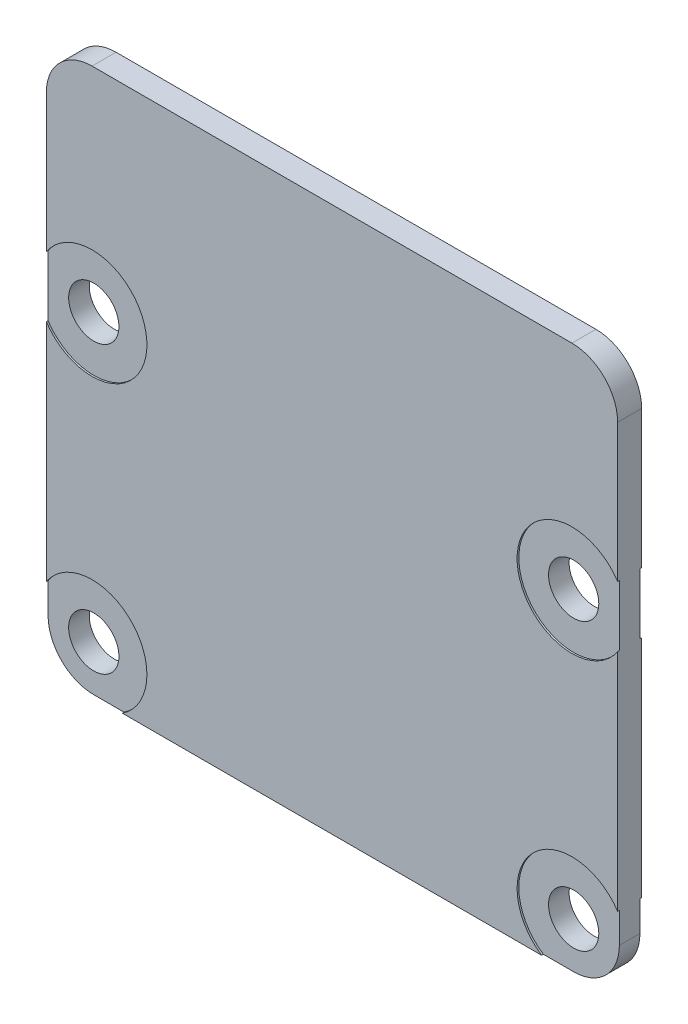
ISO-10303-21;
HEADER;
FILE_DESCRIPTION(('STEP AP214'),'2;1');
FILE_NAME('part.step','',(''),(''),'','','');
FILE_SCHEMA(('AUTOMOTIVE_DESIGN { 1 0 10303 214 1 1 1 1 }'));
ENDSEC;
DATA;
#1=APPLICATION_CONTEXT('core data for automotive mechanical design processes');
#2=APPLICATION_PROTOCOL_DEFINITION('international standard','automotive_design',2000,#1);
#3=PRODUCT_CONTEXT('',#1,'mechanical');
#4=PRODUCT('Part','Part','',(#3));
#5=PRODUCT_RELATED_PRODUCT_CATEGORY('part','',(#4));
#6=PRODUCT_DEFINITION_FORMATION('','',#4);
#7=PRODUCT_DEFINITION_CONTEXT('part definition',#1,'design');
#8=PRODUCT_DEFINITION('design','',#6,#7);
#9=PRODUCT_DEFINITION_SHAPE('','',#8);
#10=(LENGTH_UNIT() NAMED_UNIT(*) SI_UNIT(.MILLI.,.METRE.));
#11=(NAMED_UNIT(*) PLANE_ANGLE_UNIT() SI_UNIT($,.RADIAN.));
#12=(NAMED_UNIT(*) SI_UNIT($,.STERADIAN.) SOLID_ANGLE_UNIT());
#13=UNCERTAINTY_MEASURE_WITH_UNIT(LENGTH_MEASURE(1.E-05),#10,'distance_accuracy_value','');
#14=(GEOMETRIC_REPRESENTATION_CONTEXT(3) GLOBAL_UNCERTAINTY_ASSIGNED_CONTEXT((#13)) GLOBAL_UNIT_ASSIGNED_CONTEXT((#10,
#11,#12)) REPRESENTATION_CONTEXT('',''));
#15=CARTESIAN_POINT('',(0.,0.,0.));
#16=DIRECTION('',(0.,0.,1.));
#17=DIRECTION('',(1.,0.,0.));
#18=AXIS2_PLACEMENT_3D('',#15,#16,#17);
#19=CARTESIAN_POINT('',(0.,0.,-0.9));
#20=DIRECTION('',(0.,0.,1.));
#21=DIRECTION('',(1.,0.,0.));
#22=AXIS2_PLACEMENT_3D('',#19,#20,#21);
#23=PLANE('',#22);
#24=CARTESIAN_POINT('',(-10.5,0.100000000000003,-0.9));
#25=DIRECTION('',(0.,0.,1.));
#26=DIRECTION('',(1.,0.,0.));
#27=AXIS2_PLACEMENT_3D('',#24,#25,#26);
#28=CIRCLE('',#27,1.1);
#29=CARTESIAN_POINT('',(-9.4,0.100000000000003,-0.9));
#30=VERTEX_POINT('',#29);
#31=EDGE_CURVE('E346',#30,#30,#28,.T.);
#32=ORIENTED_EDGE('',*,*,#31,.T.);
#33=EDGE_LOOP('',(#32));
#34=FACE_BOUND('',#33,.T.);
#35=CARTESIAN_POINT('',(-10.5,0.100000000000003,-0.9));
#36=DIRECTION('',(0.,0.,1.));
#37=DIRECTION('',(-1.,0.,0.));
#38=AXIS2_PLACEMENT_3D('',#35,#36,#37);
#39=CIRCLE('',#38,2.4);
#40=CARTESIAN_POINT('',(-12.5,-1.22664991614215,-0.9));
#41=VERTEX_POINT('',#40);
#42=CARTESIAN_POINT('',(-12.5,1.42664991614216,-0.9));
#43=VERTEX_POINT('',#42);
#44=EDGE_CURVE('E214',#41,#43,#39,.T.);
#45=ORIENTED_EDGE('',*,*,#44,.F.);
#46=DIRECTION('',(0.,-1.,0.));
#47=VECTOR('',#46,1.);
#48=CARTESIAN_POINT('',(-12.5,9.462,-0.9));
#49=LINE('',#48,#47);
#50=EDGE_CURVE('E354',#43,#41,#49,.T.);
#51=ORIENTED_EDGE('',*,*,#50,.F.);
#52=EDGE_LOOP('',(#45,#51));
#53=FACE_BOUND('',#52,.T.);
#54=ADVANCED_FACE('F32',(#34,#53),#23,.F.);
#55=CARTESIAN_POINT('',(-10.5,-12.4,-0.9));
#56=DIRECTION('',(0.,0.,1.));
#57=DIRECTION('',(1.,0.,0.));
#58=AXIS2_PLACEMENT_3D('',#55,#56,#57);
#59=CIRCLE('',#58,1.1);
#60=CARTESIAN_POINT('',(-9.4,-12.4,-0.9));
#61=VERTEX_POINT('',#60);
#62=EDGE_CURVE('E328',#61,#61,#59,.T.);
#63=ORIENTED_EDGE('',*,*,#62,.T.);
#64=EDGE_LOOP('',(#63));
#65=FACE_BOUND('',#64,.T.);
#66=CARTESIAN_POINT('',(-10.5,-12.4,-0.9));
#67=DIRECTION('',(0.,0.,1.));
#68=DIRECTION('',(-1.,0.,0.));
#69=AXIS2_PLACEMENT_3D('',#66,#67,#68);
#70=CIRCLE('',#69,2.4);
#71=CARTESIAN_POINT('',(-9.17335008385784,-14.4,-0.9));
#72=VERTEX_POINT('',#71);
#73=CARTESIAN_POINT('',(-12.5,-11.0733500838578,-0.9));
#74=VERTEX_POINT('',#73);
#75=EDGE_CURVE('E217',#72,#74,#70,.T.);
#76=ORIENTED_EDGE('',*,*,#75,.F.);
#77=DIRECTION('',(1.,0.,0.));
#78=VECTOR('',#77,1.);
#79=CARTESIAN_POINT('',(-12.5,-14.4,-0.9));
#80=LINE('',#79,#78);
#81=CARTESIAN_POINT('',(-10.5,-14.4,-0.9));
#82=VERTEX_POINT('',#81);
#83=EDGE_CURVE('E356',#82,#72,#80,.T.);
#84=ORIENTED_EDGE('',*,*,#83,.F.);
#85=CARTESIAN_POINT('',(-10.5,-12.4,-0.9));
#86=DIRECTION('',(0.,0.,1.));
#87=DIRECTION('',(1.,0.,0.));
#88=AXIS2_PLACEMENT_3D('',#85,#86,#87);
#89=CIRCLE('',#88,2.);
#90=CARTESIAN_POINT('',(-12.5,-12.4,-0.9));
#91=VERTEX_POINT('',#90);
#92=EDGE_CURVE('E387',#82,#91,#89,.F.);
#93=ORIENTED_EDGE('',*,*,#92,.T.);
#94=EDGE_CURVE('E352',#74,#91,#49,.T.);
#95=ORIENTED_EDGE('',*,*,#94,.F.);
#96=EDGE_LOOP('',(#76,#84,#93,#95));
#97=FACE_BOUND('',#96,.T.);
#98=ADVANCED_FACE('F428',(#65,#97),#23,.F.);
#99=CARTESIAN_POINT('',(10.5,-12.4,-0.9));
#100=DIRECTION('',(0.,0.,1.));
#101=DIRECTION('',(1.,0.,0.));
#102=AXIS2_PLACEMENT_3D('',#99,#100,#101);
#103=CIRCLE('',#102,1.1);
#104=CARTESIAN_POINT('',(11.6,-12.4,-0.9));
#105=VERTEX_POINT('',#104);
#106=EDGE_CURVE('E335',#105,#105,#103,.T.);
#107=ORIENTED_EDGE('',*,*,#106,.T.);
#108=EDGE_LOOP('',(#107));
#109=FACE_BOUND('',#108,.T.);
#110=CARTESIAN_POINT('',(10.5,-12.4,-0.9));
#111=DIRECTION('',(0.,0.,1.));
#112=DIRECTION('',(-1.,0.,0.));
#113=AXIS2_PLACEMENT_3D('',#110,#111,#112);
#114=CIRCLE('',#113,2.4);
#115=CARTESIAN_POINT('',(12.5,-11.0733500838578,-0.9));
#116=VERTEX_POINT('',#115);
#117=CARTESIAN_POINT('',(9.17335008385784,-14.4,-0.9));
#118=VERTEX_POINT('',#117);
#119=EDGE_CURVE('E54',#116,#118,#114,.T.);
#120=ORIENTED_EDGE('',*,*,#119,.F.);
#121=DIRECTION('',(0.,1.,0.));
#122=VECTOR('',#121,1.);
#123=CARTESIAN_POINT('',(12.5,9.462,-0.9));
#124=LINE('',#123,#122);
#125=CARTESIAN_POINT('',(12.5,-12.4,-0.9));
#126=VERTEX_POINT('',#125);
#127=EDGE_CURVE('E361',#126,#116,#124,.T.);
#128=ORIENTED_EDGE('',*,*,#127,.F.);
#129=CARTESIAN_POINT('',(10.5,-12.4,-0.9));
#130=DIRECTION('',(0.,0.,1.));
#131=DIRECTION('',(1.,0.,0.));
#132=AXIS2_PLACEMENT_3D('',#129,#130,#131);
#133=CIRCLE('',#132,2.);
#134=CARTESIAN_POINT('',(10.5,-14.4,-0.9));
#135=VERTEX_POINT('',#134);
#136=EDGE_CURVE('E384',#126,#135,#133,.F.);
#137=ORIENTED_EDGE('',*,*,#136,.T.);
#138=EDGE_CURVE('E360',#118,#135,#80,.T.);
#139=ORIENTED_EDGE('',*,*,#138,.F.);
#140=EDGE_LOOP('',(#120,#128,#137,#139));
#141=FACE_BOUND('',#140,.T.);
#142=ADVANCED_FACE('F401',(#109,#141),#23,.F.);
#143=CARTESIAN_POINT('',(10.5,0.100000000000003,-0.9));
#144=DIRECTION('',(0.,0.,1.));
#145=DIRECTION('',(1.,0.,0.));
#146=AXIS2_PLACEMENT_3D('',#143,#144,#145);
#147=CIRCLE('',#146,1.1);
#148=CARTESIAN_POINT('',(11.6,0.100000000000003,-0.9));
#149=VERTEX_POINT('',#148);
#150=EDGE_CURVE('E341',#149,#149,#147,.T.);
#151=ORIENTED_EDGE('',*,*,#150,.T.);
#152=EDGE_LOOP('',(#151));
#153=FACE_BOUND('',#152,.T.);
#154=CARTESIAN_POINT('',(10.5,0.100000000000003,-0.9));
#155=DIRECTION('',(0.,0.,1.));
#156=DIRECTION('',(-1.,0.,0.));
#157=AXIS2_PLACEMENT_3D('',#154,#155,#156);
#158=CIRCLE('',#157,2.4);
#159=CARTESIAN_POINT('',(12.5,1.42664991614216,-0.9));
#160=VERTEX_POINT('',#159);
#161=CARTESIAN_POINT('',(12.5,-1.22664991614215,-0.9));
#162=VERTEX_POINT('',#161);
#163=EDGE_CURVE('E46',#160,#162,#158,.T.);
#164=ORIENTED_EDGE('',*,*,#163,.F.);
#165=EDGE_CURVE('E359',#162,#160,#124,.T.);
#166=ORIENTED_EDGE('',*,*,#165,.F.);
#167=EDGE_LOOP('',(#164,#166));
#168=FACE_BOUND('',#167,.T.);
#169=ADVANCED_FACE('F491',(#153,#168),#23,.F.);
#170=CARTESIAN_POINT('',(0.,0.,0.));
#171=DIRECTION('',(0.,0.,1.));
#172=DIRECTION('',(1.,0.,0.));
#173=AXIS2_PLACEMENT_3D('',#170,#171,#172);
#174=PLANE('',#173);
#175=CARTESIAN_POINT('',(10.5,0.100000000000003,0.));
#176=DIRECTION('',(0.,0.,1.));
#177=DIRECTION('',(1.,0.,0.));
#178=AXIS2_PLACEMENT_3D('',#175,#176,#177);
#179=CIRCLE('',#178,1.1);
#180=CARTESIAN_POINT('',(11.6,0.100000000000003,0.));
#181=VERTEX_POINT('',#180);
#182=EDGE_CURVE('E327',#181,#181,#179,.T.);
#183=ORIENTED_EDGE('',*,*,#182,.F.);
#184=EDGE_LOOP('',(#183));
#185=FACE_BOUND('',#184,.T.);
#186=CARTESIAN_POINT('',(10.5,0.100000000000003,0.));
#187=DIRECTION('',(0.,0.,-1.));
#188=DIRECTION('',(1.,0.,0.));
#189=AXIS2_PLACEMENT_3D('',#186,#187,#188);
#190=CIRCLE('',#189,2.4);
#191=CARTESIAN_POINT('',(12.5,-1.22664991614216,0.));
#192=VERTEX_POINT('',#191);
#193=CARTESIAN_POINT('',(12.5,1.42664991614216,0.));
#194=VERTEX_POINT('',#193);
#195=EDGE_CURVE('E269',#192,#194,#190,.T.);
#196=ORIENTED_EDGE('',*,*,#195,.F.);
#197=DIRECTION('',(0.,1.,0.));
#198=VECTOR('',#197,1.);
#199=CARTESIAN_POINT('',(12.5,9.462,0.));
#200=LINE('',#199,#198);
#201=EDGE_CURVE('E368',#192,#194,#200,.T.);
#202=ORIENTED_EDGE('',*,*,#201,.T.);
#203=EDGE_LOOP('',(#196,#202));
#204=FACE_BOUND('',#203,.T.);
#205=ADVANCED_FACE('F499',(#185,#204),#174,.T.);
#206=CARTESIAN_POINT('',(10.5,-12.4,0.));
#207=DIRECTION('',(0.,0.,1.));
#208=DIRECTION('',(1.,0.,0.));
#209=AXIS2_PLACEMENT_3D('',#206,#207,#208);
#210=CIRCLE('',#209,1.1);
#211=CARTESIAN_POINT('',(11.6,-12.4,0.));
#212=VERTEX_POINT('',#211);
#213=EDGE_CURVE('E338',#212,#212,#210,.T.);
#214=ORIENTED_EDGE('',*,*,#213,.F.);
#215=EDGE_LOOP('',(#214));
#216=FACE_BOUND('',#215,.T.);
#217=CARTESIAN_POINT('',(10.5,-12.4,0.));
#218=DIRECTION('',(0.,0.,-1.));
#219=DIRECTION('',(1.,0.,0.));
#220=AXIS2_PLACEMENT_3D('',#217,#218,#219);
#221=CIRCLE('',#220,2.4);
#222=CARTESIAN_POINT('',(9.17335008385784,-14.4,0.));
#223=VERTEX_POINT('',#222);
#224=CARTESIAN_POINT('',(12.5,-11.0733500838578,0.));
#225=VERTEX_POINT('',#224);
#226=EDGE_CURVE('E299',#223,#225,#221,.T.);
#227=ORIENTED_EDGE('',*,*,#226,.F.);
#228=DIRECTION('',(1.,0.,0.));
#229=VECTOR('',#228,1.);
#230=CARTESIAN_POINT('',(-12.5,-14.4,0.));
#231=LINE('',#230,#229);
#232=CARTESIAN_POINT('',(10.5,-14.4,0.));
#233=VERTEX_POINT('',#232);
#234=EDGE_CURVE('E369',#223,#233,#231,.T.);
#235=ORIENTED_EDGE('',*,*,#234,.T.);
#236=CARTESIAN_POINT('',(10.5,-12.4,0.));
#237=DIRECTION('',(0.,0.,1.));
#238=DIRECTION('',(1.,0.,0.));
#239=AXIS2_PLACEMENT_3D('',#236,#237,#238);
#240=CIRCLE('',#239,2.);
#241=CARTESIAN_POINT('',(12.5,-12.4,0.));
#242=VERTEX_POINT('',#241);
#243=EDGE_CURVE('E375',#233,#242,#240,.T.);
#244=ORIENTED_EDGE('',*,*,#243,.T.);
#245=EDGE_CURVE('E355',#242,#225,#200,.T.);
#246=ORIENTED_EDGE('',*,*,#245,.T.);
#247=EDGE_LOOP('',(#227,#235,#244,#246));
#248=FACE_BOUND('',#247,.T.);
#249=ADVANCED_FACE('F455',(#216,#248),#174,.T.);
#250=CARTESIAN_POINT('',(-10.5,-12.4,0.));
#251=DIRECTION('',(0.,0.,1.));
#252=DIRECTION('',(1.,0.,0.));
#253=AXIS2_PLACEMENT_3D('',#250,#251,#252);
#254=CIRCLE('',#253,1.1);
#255=CARTESIAN_POINT('',(-9.4,-12.4,0.));
#256=VERTEX_POINT('',#255);
#257=EDGE_CURVE('E332',#256,#256,#254,.T.);
#258=ORIENTED_EDGE('',*,*,#257,.F.);
#259=EDGE_LOOP('',(#258));
#260=FACE_BOUND('',#259,.T.);
#261=CARTESIAN_POINT('',(-10.5,-12.4,0.));
#262=DIRECTION('',(0.,0.,-1.));
#263=DIRECTION('',(1.,0.,0.));
#264=AXIS2_PLACEMENT_3D('',#261,#262,#263);
#265=CIRCLE('',#264,2.4);
#266=CARTESIAN_POINT('',(-12.5,-11.0733500838578,0.));
#267=VERTEX_POINT('',#266);
#268=CARTESIAN_POINT('',(-9.17335008385784,-14.4,0.));
#269=VERTEX_POINT('',#268);
#270=EDGE_CURVE('E296',#267,#269,#265,.T.);
#271=ORIENTED_EDGE('',*,*,#270,.F.);
#272=DIRECTION('',(0.,-1.,0.));
#273=VECTOR('',#272,1.);
#274=CARTESIAN_POINT('',(-12.5,9.462,0.));
#275=LINE('',#274,#273);
#276=CARTESIAN_POINT('',(-12.5,-12.4,0.));
#277=VERTEX_POINT('',#276);
#278=EDGE_CURVE('E349',#267,#277,#275,.T.);
#279=ORIENTED_EDGE('',*,*,#278,.T.);
#280=CARTESIAN_POINT('',(-10.5,-12.4,0.));
#281=DIRECTION('',(0.,0.,1.));
#282=DIRECTION('',(1.,0.,0.));
#283=AXIS2_PLACEMENT_3D('',#280,#281,#282);
#284=CIRCLE('',#283,2.);
#285=CARTESIAN_POINT('',(-10.5,-14.4,0.));
#286=VERTEX_POINT('',#285);
#287=EDGE_CURVE('E377',#277,#286,#284,.T.);
#288=ORIENTED_EDGE('',*,*,#287,.T.);
#289=EDGE_CURVE('E366',#286,#269,#231,.T.);
#290=ORIENTED_EDGE('',*,*,#289,.T.);
#291=EDGE_LOOP('',(#271,#279,#288,#290));
#292=FACE_BOUND('',#291,.T.);
#293=ADVANCED_FACE('F538',(#260,#292),#174,.T.);
#294=CARTESIAN_POINT('',(-10.5,0.100000000000003,0.));
#295=DIRECTION('',(0.,0.,1.));
#296=DIRECTION('',(1.,0.,0.));
#297=AXIS2_PLACEMENT_3D('',#294,#295,#296);
#298=CIRCLE('',#297,1.1);
#299=CARTESIAN_POINT('',(-9.4,0.100000000000003,0.));
#300=VERTEX_POINT('',#299);
#301=EDGE_CURVE('E331',#300,#300,#298,.T.);
#302=ORIENTED_EDGE('',*,*,#301,.F.);
#303=EDGE_LOOP('',(#302));
#304=FACE_BOUND('',#303,.T.);
#305=CARTESIAN_POINT('',(-10.5,0.100000000000003,0.));
#306=DIRECTION('',(0.,0.,-1.));
#307=DIRECTION('',(1.,0.,0.));
#308=AXIS2_PLACEMENT_3D('',#305,#306,#307);
#309=CIRCLE('',#308,2.4);
#310=CARTESIAN_POINT('',(-12.5,1.42664991614216,0.));
#311=VERTEX_POINT('',#310);
#312=CARTESIAN_POINT('',(-12.5,-1.22664991614215,0.));
#313=VERTEX_POINT('',#312);
#314=EDGE_CURVE('E266',#311,#313,#309,.T.);
#315=ORIENTED_EDGE('',*,*,#314,.F.);
#316=EDGE_CURVE('E365',#311,#313,#275,.T.);
#317=ORIENTED_EDGE('',*,*,#316,.T.);
#318=EDGE_LOOP('',(#315,#317));
#319=FACE_BOUND('',#318,.T.);
#320=ADVANCED_FACE('F453',(#304,#319),#174,.T.);
#321=CARTESIAN_POINT('',(-12.5,9.462,-0.9));
#322=DIRECTION('',(-1.,0.,0.));
#323=DIRECTION('',(0.,-1.,0.));
#324=AXIS2_PLACEMENT_3D('',#321,#322,#323);
#325=PLANE('',#324);
#326=DIRECTION('',(0.,0.,1.));
#327=VECTOR('',#326,1.);
#328=CARTESIAN_POINT('',(-12.5,7.462,-0.9));
#329=LINE('',#328,#327);
#330=CARTESIAN_POINT('',(-12.5,7.462,0.075));
#331=VERTEX_POINT('',#330);
#332=CARTESIAN_POINT('',(-12.5,7.462,-0.975));
#333=VERTEX_POINT('',#332);
#334=EDGE_CURVE('E363',#331,#333,#329,.F.);
#335=ORIENTED_EDGE('',*,*,#334,.T.);
#336=DIRECTION('',(0.,1.,0.));
#337=VECTOR('',#336,1.);
#338=CARTESIAN_POINT('',(-12.5,1.42664991614216,-0.975));
#339=LINE('',#338,#337);
#340=CARTESIAN_POINT('',(-12.5,1.42664991614216,-0.975));
#341=VERTEX_POINT('',#340);
#342=EDGE_CURVE('E213',#341,#333,#339,.T.);
#343=ORIENTED_EDGE('',*,*,#342,.F.);
#344=DIRECTION('',(0.,0.,1.));
#345=VECTOR('',#344,1.);
#346=CARTESIAN_POINT('',(-12.5,1.42664991614216,-0.975));
#347=LINE('',#346,#345);
#348=EDGE_CURVE('E238',#341,#43,#347,.T.);
#349=ORIENTED_EDGE('',*,*,#348,.T.);
#350=ORIENTED_EDGE('',*,*,#50,.T.);
#351=DIRECTION('',(0.,0.,1.));
#352=VECTOR('',#351,1.);
#353=CARTESIAN_POINT('',(-12.5,-1.22664991614215,-0.975));
#354=LINE('',#353,#352);
#355=CARTESIAN_POINT('',(-12.5,-1.22664991614215,-0.975));
#356=VERTEX_POINT('',#355);
#357=EDGE_CURVE('E245',#356,#41,#354,.T.);
#358=ORIENTED_EDGE('',*,*,#357,.F.);
#359=DIRECTION('',(0.,1.,0.));
#360=VECTOR('',#359,1.);
#361=CARTESIAN_POINT('',(-12.5,-11.0733500838578,-0.975));
#362=LINE('',#361,#360);
#363=CARTESIAN_POINT('',(-12.5,-11.0733500838578,-0.975));
#364=VERTEX_POINT('',#363);
#365=EDGE_CURVE('E233',#364,#356,#362,.T.);
#366=ORIENTED_EDGE('',*,*,#365,.F.);
#367=DIRECTION('',(0.,0.,1.));
#368=VECTOR('',#367,1.);
#369=CARTESIAN_POINT('',(-12.5,-11.0733500838578,-0.975));
#370=LINE('',#369,#368);
#371=EDGE_CURVE('E248',#364,#74,#370,.T.);
#372=ORIENTED_EDGE('',*,*,#371,.T.);
#373=ORIENTED_EDGE('',*,*,#94,.T.);
#374=DIRECTION('',(0.,0.,1.));
#375=VECTOR('',#374,1.);
#376=CARTESIAN_POINT('',(-12.5,-12.4,-0.9));
#377=LINE('',#376,#375);
#378=EDGE_CURVE('E372',#91,#277,#377,.T.);
#379=ORIENTED_EDGE('',*,*,#378,.T.);
#380=ORIENTED_EDGE('',*,*,#278,.F.);
#381=DIRECTION('',(0.,0.,-1.));
#382=VECTOR('',#381,1.);
#383=CARTESIAN_POINT('',(-12.5,-11.0733500838578,0.075));
#384=LINE('',#383,#382);
#385=CARTESIAN_POINT('',(-12.5,-11.0733500838578,0.075));
#386=VERTEX_POINT('',#385);
#387=EDGE_CURVE('E318',#386,#267,#384,.T.);
#388=ORIENTED_EDGE('',*,*,#387,.F.);
#389=DIRECTION('',(0.,-1.,0.));
#390=VECTOR('',#389,1.);
#391=CARTESIAN_POINT('',(-12.5,-1.22664991614215,0.075));
#392=LINE('',#391,#390);
#393=CARTESIAN_POINT('',(-12.5,-1.22664991614215,0.075));
#394=VERTEX_POINT('',#393);
#395=EDGE_CURVE('E273',#394,#386,#392,.T.);
#396=ORIENTED_EDGE('',*,*,#395,.F.);
#397=DIRECTION('',(0.,0.,-1.));
#398=VECTOR('',#397,1.);
#399=CARTESIAN_POINT('',(-12.5,-1.22664991614215,0.075));
#400=LINE('',#399,#398);
#401=EDGE_CURVE('E321',#394,#313,#400,.T.);
#402=ORIENTED_EDGE('',*,*,#401,.T.);
#403=ORIENTED_EDGE('',*,*,#316,.F.);
#404=DIRECTION('',(0.,0.,-1.));
#405=VECTOR('',#404,1.);
#406=CARTESIAN_POINT('',(-12.5,1.42664991614216,0.075));
#407=LINE('',#406,#405);
#408=CARTESIAN_POINT('',(-12.5,1.42664991614216,0.075));
#409=VERTEX_POINT('',#408);
#410=EDGE_CURVE('E324',#409,#311,#407,.T.);
#411=ORIENTED_EDGE('',*,*,#410,.F.);
#412=DIRECTION('',(0.,-1.,0.));
#413=VECTOR('',#412,1.);
#414=CARTESIAN_POINT('',(-12.5,7.462,0.075));
#415=LINE('',#414,#413);
#416=EDGE_CURVE('E268',#331,#409,#415,.T.);
#417=ORIENTED_EDGE('',*,*,#416,.F.);
#418=EDGE_LOOP('',(#335,#343,#349,#350,#358,#366,#372,#373,#379,#380,#388,#396,#402,#403,#411,#417));
#419=FACE_BOUND('',#418,.T.);
#420=ADVANCED_FACE('F414',(#419),#325,.T.);
#421=CARTESIAN_POINT('',(-12.5,9.462,-0.9));
#422=DIRECTION('',(0.,1.,0.));
#423=DIRECTION('',(0.,0.,1.));
#424=AXIS2_PLACEMENT_3D('',#421,#422,#423);
#425=PLANE('',#424);
#426=DIRECTION('',(0.,0.,1.));
#427=VECTOR('',#426,1.);
#428=CARTESIAN_POINT('',(10.5,9.462,-0.9));
#429=LINE('',#428,#427);
#430=CARTESIAN_POINT('',(10.5,9.462,0.075));
#431=VERTEX_POINT('',#430);
#432=CARTESIAN_POINT('',(10.5,9.462,-0.975));
#433=VERTEX_POINT('',#432);
#434=EDGE_CURVE('E40',#431,#433,#429,.F.);
#435=ORIENTED_EDGE('',*,*,#434,.T.);
#436=DIRECTION('',(1.,0.,0.));
#437=VECTOR('',#436,1.);
#438=CARTESIAN_POINT('',(-10.5,9.462,-0.975));
#439=LINE('',#438,#437);
#440=CARTESIAN_POINT('',(-10.5,9.462,-0.975));
#441=VERTEX_POINT('',#440);
#442=EDGE_CURVE('E203',#441,#433,#439,.T.);
#443=ORIENTED_EDGE('',*,*,#442,.F.);
#444=DIRECTION('',(0.,0.,1.));
#445=VECTOR('',#444,1.);
#446=CARTESIAN_POINT('',(-10.5,9.462,-0.9));
#447=LINE('',#446,#445);
#448=CARTESIAN_POINT('',(-10.5,9.462,0.075));
#449=VERTEX_POINT('',#448);
#450=EDGE_CURVE('E11',#441,#449,#447,.T.);
#451=ORIENTED_EDGE('',*,*,#450,.T.);
#452=DIRECTION('',(-1.,0.,0.));
#453=VECTOR('',#452,1.);
#454=CARTESIAN_POINT('',(10.5,9.462,0.075));
#455=LINE('',#454,#453);
#456=EDGE_CURVE('E291',#431,#449,#455,.T.);
#457=ORIENTED_EDGE('',*,*,#456,.F.);
#458=EDGE_LOOP('',(#435,#443,#451,#457));
#459=FACE_BOUND('',#458,.T.);
#460=ADVANCED_FACE('F204',(#459),#425,.T.);
#461=CARTESIAN_POINT('',(12.5,9.462,-0.9));
#462=DIRECTION('',(1.,0.,0.));
#463=DIRECTION('',(0.,1.,0.));
#464=AXIS2_PLACEMENT_3D('',#461,#462,#463);
#465=PLANE('',#464);
#466=ORIENTED_EDGE('',*,*,#245,.F.);
#467=DIRECTION('',(0.,0.,1.));
#468=VECTOR('',#467,1.);
#469=CARTESIAN_POINT('',(12.5,-12.4,-0.9));
#470=LINE('',#469,#468);
#471=EDGE_CURVE('E392',#242,#126,#470,.F.);
#472=ORIENTED_EDGE('',*,*,#471,.T.);
#473=ORIENTED_EDGE('',*,*,#127,.T.);
#474=DIRECTION('',(0.,0.,1.));
#475=VECTOR('',#474,1.);
#476=CARTESIAN_POINT('',(12.5,-11.0733500838578,-0.975));
#477=LINE('',#476,#475);
#478=CARTESIAN_POINT('',(12.5,-11.0733500838578,-0.975));
#479=VERTEX_POINT('',#478);
#480=EDGE_CURVE('E257',#479,#116,#477,.T.);
#481=ORIENTED_EDGE('',*,*,#480,.F.);
#482=DIRECTION('',(0.,-1.,0.));
#483=VECTOR('',#482,1.);
#484=CARTESIAN_POINT('',(12.5,-1.22664991614215,-0.975));
#485=LINE('',#484,#483);
#486=CARTESIAN_POINT('',(12.5,-1.22664991614215,-0.975));
#487=VERTEX_POINT('',#486);
#488=EDGE_CURVE('E225',#487,#479,#485,.T.);
#489=ORIENTED_EDGE('',*,*,#488,.F.);
#490=DIRECTION('',(0.,0.,1.));
#491=VECTOR('',#490,1.);
#492=CARTESIAN_POINT('',(12.5,-1.22664991614215,-0.975));
#493=LINE('',#492,#491);
#494=EDGE_CURVE('E260',#487,#162,#493,.T.);
#495=ORIENTED_EDGE('',*,*,#494,.T.);
#496=ORIENTED_EDGE('',*,*,#165,.T.);
#497=DIRECTION('',(0.,0.,1.));
#498=VECTOR('',#497,1.);
#499=CARTESIAN_POINT('',(12.5,1.42664991614216,-0.975));
#500=LINE('',#499,#498);
#501=CARTESIAN_POINT('',(12.5,1.42664991614216,-0.975));
#502=VERTEX_POINT('',#501);
#503=EDGE_CURVE('E263',#502,#160,#500,.T.);
#504=ORIENTED_EDGE('',*,*,#503,.F.);
#505=DIRECTION('',(0.,-1.,0.));
#506=VECTOR('',#505,1.);
#507=CARTESIAN_POINT('',(12.5,7.462,-0.975));
#508=LINE('',#507,#506);
#509=CARTESIAN_POINT('',(12.5,7.462,-0.975));
#510=VERTEX_POINT('',#509);
#511=EDGE_CURVE('E221',#510,#502,#508,.T.);
#512=ORIENTED_EDGE('',*,*,#511,.F.);
#513=DIRECTION('',(0.,0.,1.));
#514=VECTOR('',#513,1.);
#515=CARTESIAN_POINT('',(12.5,7.462,-0.9));
#516=LINE('',#515,#514);
#517=CARTESIAN_POINT('',(12.5,7.462,0.075));
#518=VERTEX_POINT('',#517);
#519=EDGE_CURVE('E390',#510,#518,#516,.T.);
#520=ORIENTED_EDGE('',*,*,#519,.T.);
#521=DIRECTION('',(0.,1.,0.));
#522=VECTOR('',#521,1.);
#523=CARTESIAN_POINT('',(12.5,1.42664991614216,0.075));
#524=LINE('',#523,#522);
#525=CARTESIAN_POINT('',(12.5,1.42664991614216,0.075));
#526=VERTEX_POINT('',#525);
#527=EDGE_CURVE('E285',#526,#518,#524,.T.);
#528=ORIENTED_EDGE('',*,*,#527,.F.);
#529=DIRECTION('',(0.,0.,-1.));
#530=VECTOR('',#529,1.);
#531=CARTESIAN_POINT('',(12.5,1.42664991614216,0.075));
#532=LINE('',#531,#530);
#533=EDGE_CURVE('E293',#526,#194,#532,.T.);
#534=ORIENTED_EDGE('',*,*,#533,.T.);
#535=ORIENTED_EDGE('',*,*,#201,.F.);
#536=DIRECTION('',(0.,0.,-1.));
#537=VECTOR('',#536,1.);
#538=CARTESIAN_POINT('',(12.5,-1.22664991614216,0.075));
#539=LINE('',#538,#537);
#540=CARTESIAN_POINT('',(12.5,-1.22664991614216,0.075));
#541=VERTEX_POINT('',#540);
#542=EDGE_CURVE('E306',#541,#192,#539,.T.);
#543=ORIENTED_EDGE('',*,*,#542,.F.);
#544=DIRECTION('',(0.,1.,0.));
#545=VECTOR('',#544,1.);
#546=CARTESIAN_POINT('',(12.5,-11.0733500838578,0.075));
#547=LINE('',#546,#545);
#548=CARTESIAN_POINT('',(12.5,-11.0733500838578,0.075));
#549=VERTEX_POINT('',#548);
#550=EDGE_CURVE('E281',#549,#541,#547,.T.);
#551=ORIENTED_EDGE('',*,*,#550,.F.);
#552=DIRECTION('',(0.,0.,-1.));
#553=VECTOR('',#552,1.);
#554=CARTESIAN_POINT('',(12.5,-11.0733500838578,0.075));
#555=LINE('',#554,#553);
#556=EDGE_CURVE('E309',#549,#225,#555,.T.);
#557=ORIENTED_EDGE('',*,*,#556,.T.);
#558=EDGE_LOOP('',(#466,#472,#473,#481,#489,#495,#496,#504,#512,#520,#528,#534,#535,#543,#551,#557));
#559=FACE_BOUND('',#558,.T.);
#560=ADVANCED_FACE('F396',(#559),#465,.T.);
#561=CARTESIAN_POINT('',(-12.5,-14.4,-0.9));
#562=DIRECTION('',(0.,-1.,0.));
#563=DIRECTION('',(0.,0.,-1.));
#564=AXIS2_PLACEMENT_3D('',#561,#562,#563);
#565=PLANE('',#564);
#566=ORIENTED_EDGE('',*,*,#289,.F.);
#567=DIRECTION('',(0.,0.,1.));
#568=VECTOR('',#567,1.);
#569=CARTESIAN_POINT('',(-10.5,-14.4,-0.9));
#570=LINE('',#569,#568);
#571=EDGE_CURVE('E382',#286,#82,#570,.F.);
#572=ORIENTED_EDGE('',*,*,#571,.T.);
#573=ORIENTED_EDGE('',*,*,#83,.T.);
#574=DIRECTION('',(0.,0.,1.));
#575=VECTOR('',#574,1.);
#576=CARTESIAN_POINT('',(-9.17335008385784,-14.4,-0.975));
#577=LINE('',#576,#575);
#578=CARTESIAN_POINT('',(-9.17335008385784,-14.4,-0.975));
#579=VERTEX_POINT('',#578);
#580=EDGE_CURVE('E251',#579,#72,#577,.T.);
#581=ORIENTED_EDGE('',*,*,#580,.F.);
#582=DIRECTION('',(-1.,0.,0.));
#583=VECTOR('',#582,1.);
#584=CARTESIAN_POINT('',(9.17335008385785,-14.4,-0.975));
#585=LINE('',#584,#583);
#586=CARTESIAN_POINT('',(9.17335008385785,-14.4,-0.975));
#587=VERTEX_POINT('',#586);
#588=EDGE_CURVE('E229',#587,#579,#585,.T.);
#589=ORIENTED_EDGE('',*,*,#588,.F.);
#590=DIRECTION('',(0.,0.,1.));
#591=VECTOR('',#590,1.);
#592=CARTESIAN_POINT('',(9.17335008385785,-14.4,-0.975));
#593=LINE('',#592,#591);
#594=EDGE_CURVE('E254',#587,#118,#593,.T.);
#595=ORIENTED_EDGE('',*,*,#594,.T.);
#596=ORIENTED_EDGE('',*,*,#138,.T.);
#597=DIRECTION('',(0.,0.,1.));
#598=VECTOR('',#597,1.);
#599=CARTESIAN_POINT('',(10.5,-14.4,-0.9));
#600=LINE('',#599,#598);
#601=EDGE_CURVE('E379',#135,#233,#600,.T.);
#602=ORIENTED_EDGE('',*,*,#601,.T.);
#603=ORIENTED_EDGE('',*,*,#234,.F.);
#604=DIRECTION('',(0.,0.,-1.));
#605=VECTOR('',#604,1.);
#606=CARTESIAN_POINT('',(9.17335008385785,-14.4,0.075));
#607=LINE('',#606,#605);
#608=CARTESIAN_POINT('',(9.17335008385785,-14.4,0.075));
#609=VERTEX_POINT('',#608);
#610=EDGE_CURVE('E312',#609,#223,#607,.T.);
#611=ORIENTED_EDGE('',*,*,#610,.F.);
#612=DIRECTION('',(1.,0.,0.));
#613=VECTOR('',#612,1.);
#614=CARTESIAN_POINT('',(-9.17335008385784,-14.4,0.075));
#615=LINE('',#614,#613);
#616=CARTESIAN_POINT('',(-9.17335008385784,-14.4,0.075));
#617=VERTEX_POINT('',#616);
#618=EDGE_CURVE('E277',#617,#609,#615,.T.);
#619=ORIENTED_EDGE('',*,*,#618,.F.);
#620=DIRECTION('',(0.,0.,-1.));
#621=VECTOR('',#620,1.);
#622=CARTESIAN_POINT('',(-9.17335008385784,-14.4,0.075));
#623=LINE('',#622,#621);
#624=EDGE_CURVE('E315',#617,#269,#623,.T.);
#625=ORIENTED_EDGE('',*,*,#624,.T.);
#626=EDGE_LOOP('',(#566,#572,#573,#581,#589,#595,#596,#602,#603,#611,#619,#625));
#627=FACE_BOUND('',#626,.T.);
#628=ADVANCED_FACE('F407',(#627),#565,.T.);
#629=CARTESIAN_POINT('',(-10.5,-12.4,-0.9));
#630=DIRECTION('',(0.,0.,1.));
#631=DIRECTION('',(1.,0.,0.));
#632=AXIS2_PLACEMENT_3D('',#629,#630,#631);
#633=CYLINDRICAL_SURFACE('',#632,2.);
#634=ORIENTED_EDGE('',*,*,#92,.F.);
#635=ORIENTED_EDGE('',*,*,#571,.F.);
#636=ORIENTED_EDGE('',*,*,#287,.F.);
#637=ORIENTED_EDGE('',*,*,#378,.F.);
#638=EDGE_LOOP('',(#634,#635,#636,#637));
#639=FACE_BOUND('',#638,.T.);
#640=ADVANCED_FACE('F433',(#639),#633,.T.);
#641=CARTESIAN_POINT('',(10.5,-12.4,-0.9));
#642=DIRECTION('',(0.,0.,1.));
#643=DIRECTION('',(1.,0.,0.));
#644=AXIS2_PLACEMENT_3D('',#641,#642,#643);
#645=CYLINDRICAL_SURFACE('',#644,2.);
#646=ORIENTED_EDGE('',*,*,#136,.F.);
#647=ORIENTED_EDGE('',*,*,#471,.F.);
#648=ORIENTED_EDGE('',*,*,#243,.F.);
#649=ORIENTED_EDGE('',*,*,#601,.F.);
#650=EDGE_LOOP('',(#646,#647,#648,#649));
#651=FACE_BOUND('',#650,.T.);
#652=ADVANCED_FACE('F403',(#651),#645,.T.);
#653=CARTESIAN_POINT('',(-10.5,7.462,-0.9));
#654=DIRECTION('',(0.,0.,1.));
#655=DIRECTION('',(1.,0.,0.));
#656=AXIS2_PLACEMENT_3D('',#653,#654,#655);
#657=CYLINDRICAL_SURFACE('',#656,2.);
#658=ORIENTED_EDGE('',*,*,#450,.F.);
#659=CARTESIAN_POINT('',(-10.5,7.462,-0.975));
#660=DIRECTION('',(0.,0.,-1.));
#661=DIRECTION('',(-1.,0.,0.));
#662=AXIS2_PLACEMENT_3D('',#659,#660,#661);
#663=CIRCLE('',#662,2.);
#664=EDGE_CURVE('E196',#333,#441,#663,.T.);
#665=ORIENTED_EDGE('',*,*,#664,.F.);
#666=ORIENTED_EDGE('',*,*,#334,.F.);
#667=CARTESIAN_POINT('',(-10.5,7.462,0.075));
#668=DIRECTION('',(0.,0.,1.));
#669=DIRECTION('',(1.,0.,0.));
#670=AXIS2_PLACEMENT_3D('',#667,#668,#669);
#671=CIRCLE('',#670,2.);
#672=EDGE_CURVE('E198',#449,#331,#671,.T.);
#673=ORIENTED_EDGE('',*,*,#672,.F.);
#674=EDGE_LOOP('',(#658,#665,#666,#673));
#675=FACE_BOUND('',#674,.T.);
#676=ADVANCED_FACE('F194',(#675),#657,.T.);
#677=CARTESIAN_POINT('',(10.5,7.462,-0.9));
#678=DIRECTION('',(0.,0.,1.));
#679=DIRECTION('',(1.,0.,0.));
#680=AXIS2_PLACEMENT_3D('',#677,#678,#679);
#681=CYLINDRICAL_SURFACE('',#680,2.);
#682=ORIENTED_EDGE('',*,*,#519,.F.);
#683=CARTESIAN_POINT('',(10.5,7.462,-0.975));
#684=DIRECTION('',(0.,0.,-1.));
#685=DIRECTION('',(-1.,0.,0.));
#686=AXIS2_PLACEMENT_3D('',#683,#684,#685);
#687=CIRCLE('',#686,2.);
#688=EDGE_CURVE('E208',#433,#510,#687,.T.);
#689=ORIENTED_EDGE('',*,*,#688,.F.);
#690=ORIENTED_EDGE('',*,*,#434,.F.);
#691=CARTESIAN_POINT('',(10.5,7.462,0.075));
#692=DIRECTION('',(0.,0.,1.));
#693=DIRECTION('',(1.,0.,0.));
#694=AXIS2_PLACEMENT_3D('',#691,#692,#693);
#695=CIRCLE('',#694,2.);
#696=EDGE_CURVE('E288',#518,#431,#695,.T.);
#697=ORIENTED_EDGE('',*,*,#696,.F.);
#698=EDGE_LOOP('',(#682,#689,#690,#697));
#699=FACE_BOUND('',#698,.T.);
#700=ADVANCED_FACE('F34',(#699),#681,.T.);
#701=CARTESIAN_POINT('',(-10.5,0.100000000000003,-0.9));
#702=DIRECTION('',(0.,0.,1.));
#703=DIRECTION('',(1.,0.,0.));
#704=AXIS2_PLACEMENT_3D('',#701,#702,#703);
#705=CYLINDRICAL_SURFACE('',#704,1.1);
#706=ORIENTED_EDGE('',*,*,#31,.F.);
#707=EDGE_LOOP('',(#706));
#708=FACE_BOUND('',#707,.T.);
#709=ORIENTED_EDGE('',*,*,#301,.T.);
#710=EDGE_LOOP('',(#709));
#711=FACE_BOUND('',#710,.T.);
#712=ADVANCED_FACE('F525',(#708,#711),#705,.F.);
#713=CARTESIAN_POINT('',(-10.5,-12.4,-0.9));
#714=DIRECTION('',(0.,0.,1.));
#715=DIRECTION('',(1.,0.,0.));
#716=AXIS2_PLACEMENT_3D('',#713,#714,#715);
#717=CYLINDRICAL_SURFACE('',#716,1.1);
#718=ORIENTED_EDGE('',*,*,#62,.F.);
#719=EDGE_LOOP('',(#718));
#720=FACE_BOUND('',#719,.T.);
#721=ORIENTED_EDGE('',*,*,#257,.T.);
#722=EDGE_LOOP('',(#721));
#723=FACE_BOUND('',#722,.T.);
#724=ADVANCED_FACE('F521',(#720,#723),#717,.F.);
#725=CARTESIAN_POINT('',(10.5,-12.4,-0.9));
#726=DIRECTION('',(0.,0.,1.));
#727=DIRECTION('',(1.,0.,0.));
#728=AXIS2_PLACEMENT_3D('',#725,#726,#727);
#729=CYLINDRICAL_SURFACE('',#728,1.1);
#730=ORIENTED_EDGE('',*,*,#106,.F.);
#731=EDGE_LOOP('',(#730));
#732=FACE_BOUND('',#731,.T.);
#733=ORIENTED_EDGE('',*,*,#213,.T.);
#734=EDGE_LOOP('',(#733));
#735=FACE_BOUND('',#734,.T.);
#736=ADVANCED_FACE('F512',(#732,#735),#729,.F.);
#737=CARTESIAN_POINT('',(10.5,0.100000000000003,-0.9));
#738=DIRECTION('',(0.,0.,1.));
#739=DIRECTION('',(1.,0.,0.));
#740=AXIS2_PLACEMENT_3D('',#737,#738,#739);
#741=CYLINDRICAL_SURFACE('',#740,1.1);
#742=ORIENTED_EDGE('',*,*,#150,.F.);
#743=EDGE_LOOP('',(#742));
#744=FACE_BOUND('',#743,.T.);
#745=ORIENTED_EDGE('',*,*,#182,.T.);
#746=EDGE_LOOP('',(#745));
#747=FACE_BOUND('',#746,.T.);
#748=ADVANCED_FACE('F509',(#744,#747),#741,.F.);
#749=CARTESIAN_POINT('',(-10.5,0.100000000000003,0.075));
#750=DIRECTION('',(0.,0.,-1.));
#751=DIRECTION('',(-1.,0.,0.));
#752=AXIS2_PLACEMENT_3D('',#749,#750,#751);
#753=CYLINDRICAL_SURFACE('',#752,2.4);
#754=ORIENTED_EDGE('',*,*,#314,.T.);
#755=ORIENTED_EDGE('',*,*,#401,.F.);
#756=CARTESIAN_POINT('',(-10.5,0.100000000000003,0.075));
#757=DIRECTION('',(0.,0.,-1.));
#758=DIRECTION('',(1.,0.,0.));
#759=AXIS2_PLACEMENT_3D('',#756,#757,#758);
#760=CIRCLE('',#759,2.4);
#761=EDGE_CURVE('E271',#409,#394,#760,.T.);
#762=ORIENTED_EDGE('',*,*,#761,.F.);
#763=ORIENTED_EDGE('',*,*,#410,.T.);
#764=EDGE_LOOP('',(#754,#755,#762,#763));
#765=FACE_BOUND('',#764,.T.);
#766=ADVANCED_FACE('F451',(#765),#753,.F.);
#767=CARTESIAN_POINT('',(-10.5,-12.4,0.075));
#768=DIRECTION('',(0.,0.,-1.));
#769=DIRECTION('',(-1.,0.,0.));
#770=AXIS2_PLACEMENT_3D('',#767,#768,#769);
#771=CYLINDRICAL_SURFACE('',#770,2.4);
#772=ORIENTED_EDGE('',*,*,#270,.T.);
#773=ORIENTED_EDGE('',*,*,#624,.F.);
#774=CARTESIAN_POINT('',(-10.5,-12.4,0.075));
#775=DIRECTION('',(0.,0.,-1.));
#776=DIRECTION('',(1.,0.,0.));
#777=AXIS2_PLACEMENT_3D('',#774,#775,#776);
#778=CIRCLE('',#777,2.4);
#779=EDGE_CURVE('E275',#386,#617,#778,.T.);
#780=ORIENTED_EDGE('',*,*,#779,.F.);
#781=ORIENTED_EDGE('',*,*,#387,.T.);
#782=EDGE_LOOP('',(#772,#773,#780,#781));
#783=FACE_BOUND('',#782,.T.);
#784=ADVANCED_FACE('F441',(#783),#771,.F.);
#785=CARTESIAN_POINT('',(10.5,-12.4,0.075));
#786=DIRECTION('',(0.,0.,-1.));
#787=DIRECTION('',(-1.,0.,0.));
#788=AXIS2_PLACEMENT_3D('',#785,#786,#787);
#789=CYLINDRICAL_SURFACE('',#788,2.4);
#790=ORIENTED_EDGE('',*,*,#226,.T.);
#791=ORIENTED_EDGE('',*,*,#556,.F.);
#792=CARTESIAN_POINT('',(10.5,-12.4,0.075));
#793=DIRECTION('',(0.,0.,-1.));
#794=DIRECTION('',(1.,0.,0.));
#795=AXIS2_PLACEMENT_3D('',#792,#793,#794);
#796=CIRCLE('',#795,2.4);
#797=EDGE_CURVE('E279',#609,#549,#796,.T.);
#798=ORIENTED_EDGE('',*,*,#797,.F.);
#799=ORIENTED_EDGE('',*,*,#610,.T.);
#800=EDGE_LOOP('',(#790,#791,#798,#799));
#801=FACE_BOUND('',#800,.T.);
#802=ADVANCED_FACE('F458',(#801),#789,.F.);
#803=CARTESIAN_POINT('',(10.5,0.100000000000003,0.075));
#804=DIRECTION('',(0.,0.,-1.));
#805=DIRECTION('',(-1.,0.,0.));
#806=AXIS2_PLACEMENT_3D('',#803,#804,#805);
#807=CYLINDRICAL_SURFACE('',#806,2.4);
#808=ORIENTED_EDGE('',*,*,#195,.T.);
#809=ORIENTED_EDGE('',*,*,#533,.F.);
#810=CARTESIAN_POINT('',(10.5,0.100000000000003,0.075));
#811=DIRECTION('',(0.,0.,-1.));
#812=DIRECTION('',(1.,0.,0.));
#813=AXIS2_PLACEMENT_3D('',#810,#811,#812);
#814=CIRCLE('',#813,2.4);
#815=EDGE_CURVE('E283',#541,#526,#814,.T.);
#816=ORIENTED_EDGE('',*,*,#815,.F.);
#817=ORIENTED_EDGE('',*,*,#542,.T.);
#818=EDGE_LOOP('',(#808,#809,#816,#817));
#819=FACE_BOUND('',#818,.T.);
#820=ADVANCED_FACE('F468',(#819),#807,.F.);
#821=CARTESIAN_POINT('',(-10.5,7.462,0.075));
#822=DIRECTION('',(0.,0.,1.));
#823=DIRECTION('',(1.,0.,0.));
#824=AXIS2_PLACEMENT_3D('',#821,#822,#823);
#825=PLANE('',#824);
#826=ORIENTED_EDGE('',*,*,#672,.T.);
#827=ORIENTED_EDGE('',*,*,#416,.T.);
#828=ORIENTED_EDGE('',*,*,#761,.T.);
#829=ORIENTED_EDGE('',*,*,#395,.T.);
#830=ORIENTED_EDGE('',*,*,#779,.T.);
#831=ORIENTED_EDGE('',*,*,#618,.T.);
#832=ORIENTED_EDGE('',*,*,#797,.T.);
#833=ORIENTED_EDGE('',*,*,#550,.T.);
#834=ORIENTED_EDGE('',*,*,#815,.T.);
#835=ORIENTED_EDGE('',*,*,#527,.T.);
#836=ORIENTED_EDGE('',*,*,#696,.T.);
#837=ORIENTED_EDGE('',*,*,#456,.T.);
#838=EDGE_LOOP('',(#826,#827,#828,#829,#830,#831,#832,#833,#834,#835,#836,#837));
#839=FACE_BOUND('',#838,.T.);
#840=ADVANCED_FACE('F445',(#839),#825,.T.);
#841=CARTESIAN_POINT('',(10.5,0.100000000000003,-0.975));
#842=DIRECTION('',(0.,0.,1.));
#843=DIRECTION('',(1.,0.,0.));
#844=AXIS2_PLACEMENT_3D('',#841,#842,#843);
#845=CYLINDRICAL_SURFACE('',#844,2.4);
#846=ORIENTED_EDGE('',*,*,#163,.T.);
#847=ORIENTED_EDGE('',*,*,#494,.F.);
#848=CARTESIAN_POINT('',(10.5,0.100000000000003,-0.975));
#849=DIRECTION('',(0.,0.,1.));
#850=DIRECTION('',(-1.,0.,0.));
#851=AXIS2_PLACEMENT_3D('',#848,#849,#850);
#852=CIRCLE('',#851,2.4);
#853=EDGE_CURVE('E223',#502,#487,#852,.T.);
#854=ORIENTED_EDGE('',*,*,#853,.F.);
#855=ORIENTED_EDGE('',*,*,#503,.T.);
#856=EDGE_LOOP('',(#846,#847,#854,#855));
#857=FACE_BOUND('',#856,.T.);
#858=ADVANCED_FACE('F475',(#857),#845,.F.);
#859=CARTESIAN_POINT('',(10.5,-12.4,-0.975));
#860=DIRECTION('',(0.,0.,1.));
#861=DIRECTION('',(1.,0.,0.));
#862=AXIS2_PLACEMENT_3D('',#859,#860,#861);
#863=CYLINDRICAL_SURFACE('',#862,2.4);
#864=ORIENTED_EDGE('',*,*,#119,.T.);
#865=ORIENTED_EDGE('',*,*,#594,.F.);
#866=CARTESIAN_POINT('',(10.5,-12.4,-0.975));
#867=DIRECTION('',(0.,0.,1.));
#868=DIRECTION('',(-1.,0.,0.));
#869=AXIS2_PLACEMENT_3D('',#866,#867,#868);
#870=CIRCLE('',#869,2.4);
#871=EDGE_CURVE('E227',#479,#587,#870,.T.);
#872=ORIENTED_EDGE('',*,*,#871,.F.);
#873=ORIENTED_EDGE('',*,*,#480,.T.);
#874=EDGE_LOOP('',(#864,#865,#872,#873));
#875=FACE_BOUND('',#874,.T.);
#876=ADVANCED_FACE('F479',(#875),#863,.F.);
#877=CARTESIAN_POINT('',(-10.5,-12.4,-0.975));
#878=DIRECTION('',(0.,0.,1.));
#879=DIRECTION('',(1.,0.,0.));
#880=AXIS2_PLACEMENT_3D('',#877,#878,#879);
#881=CYLINDRICAL_SURFACE('',#880,2.4);
#882=ORIENTED_EDGE('',*,*,#75,.T.);
#883=ORIENTED_EDGE('',*,*,#371,.F.);
#884=CARTESIAN_POINT('',(-10.5,-12.4,-0.975));
#885=DIRECTION('',(0.,0.,1.));
#886=DIRECTION('',(-1.,0.,0.));
#887=AXIS2_PLACEMENT_3D('',#884,#885,#886);
#888=CIRCLE('',#887,2.4);
#889=EDGE_CURVE('E231',#579,#364,#888,.T.);
#890=ORIENTED_EDGE('',*,*,#889,.F.);
#891=ORIENTED_EDGE('',*,*,#580,.T.);
#892=EDGE_LOOP('',(#882,#883,#890,#891));
#893=FACE_BOUND('',#892,.T.);
#894=ADVANCED_FACE('F424',(#893),#881,.F.);
#895=CARTESIAN_POINT('',(-10.5,0.100000000000003,-0.975));
#896=DIRECTION('',(0.,0.,1.));
#897=DIRECTION('',(1.,0.,0.));
#898=AXIS2_PLACEMENT_3D('',#895,#896,#897);
#899=CYLINDRICAL_SURFACE('',#898,2.4);
#900=ORIENTED_EDGE('',*,*,#44,.T.);
#901=ORIENTED_EDGE('',*,*,#348,.F.);
#902=CARTESIAN_POINT('',(-10.5,0.100000000000003,-0.975));
#903=DIRECTION('',(0.,0.,1.));
#904=DIRECTION('',(-1.,0.,0.));
#905=AXIS2_PLACEMENT_3D('',#902,#903,#904);
#906=CIRCLE('',#905,2.4);
#907=EDGE_CURVE('E235',#356,#341,#906,.T.);
#908=ORIENTED_EDGE('',*,*,#907,.F.);
#909=ORIENTED_EDGE('',*,*,#357,.T.);
#910=EDGE_LOOP('',(#900,#901,#908,#909));
#911=FACE_BOUND('',#910,.T.);
#912=ADVANCED_FACE('F420',(#911),#899,.F.);
#913=CARTESIAN_POINT('',(-10.5,7.462,-0.975));
#914=DIRECTION('',(0.,0.,-1.));
#915=DIRECTION('',(-1.,0.,0.));
#916=AXIS2_PLACEMENT_3D('',#913,#914,#915);
#917=PLANE('',#916);
#918=ORIENTED_EDGE('',*,*,#664,.T.);
#919=ORIENTED_EDGE('',*,*,#442,.T.);
#920=ORIENTED_EDGE('',*,*,#688,.T.);
#921=ORIENTED_EDGE('',*,*,#511,.T.);
#922=ORIENTED_EDGE('',*,*,#853,.T.);
#923=ORIENTED_EDGE('',*,*,#488,.T.);
#924=ORIENTED_EDGE('',*,*,#871,.T.);
#925=ORIENTED_EDGE('',*,*,#588,.T.);
#926=ORIENTED_EDGE('',*,*,#889,.T.);
#927=ORIENTED_EDGE('',*,*,#365,.T.);
#928=ORIENTED_EDGE('',*,*,#907,.T.);
#929=ORIENTED_EDGE('',*,*,#342,.T.);
#930=EDGE_LOOP('',(#918,#919,#920,#921,#922,#923,#924,#925,#926,#927,#928,#929));
#931=FACE_BOUND('',#930,.T.);
#932=ADVANCED_FACE('F211',(#931),#917,.T.);
#933=CLOSED_SHELL('',(#54,#98,#142,#169,#205,#249,#293,#320,#420,#460,#560,#628,#640,#652,#676,
#700,#712,#724,#736,#748,#766,#784,#802,#820,#840,#858,#876,#894,#912,#932));
#934=MANIFOLD_SOLID_BREP('B2',#933);
#935=ADVANCED_BREP_SHAPE_REPRESENTATION('',(#18,#934),#14);
#936=SHAPE_DEFINITION_REPRESENTATION(#9,#935);
ENDSEC;
END-ISO-10303-21;
